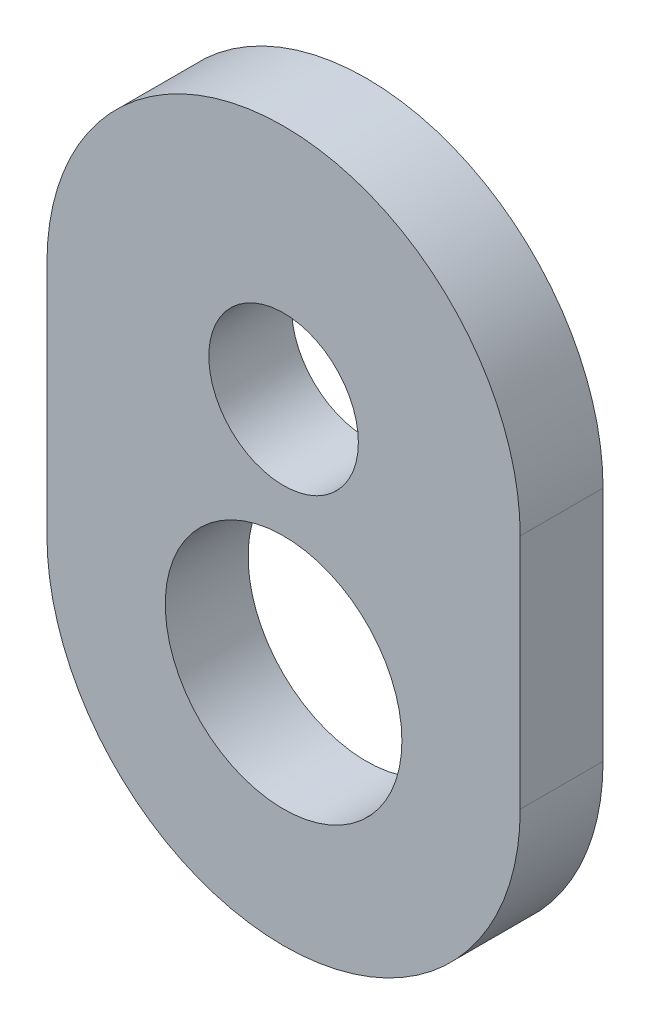
ISO-10303-21;
HEADER;
FILE_DESCRIPTION(('STEP AP214'),'2;1');
FILE_NAME('part.step','',(''),(''),'','','');
FILE_SCHEMA(('AUTOMOTIVE_DESIGN { 1 0 10303 214 1 1 1 1 }'));
ENDSEC;
DATA;
#1=APPLICATION_CONTEXT('core data for automotive mechanical design processes');
#2=APPLICATION_PROTOCOL_DEFINITION('international standard','automotive_design',2000,#1);
#3=PRODUCT_CONTEXT('',#1,'mechanical');
#4=PRODUCT('Part','Part','',(#3));
#5=PRODUCT_RELATED_PRODUCT_CATEGORY('part','',(#4));
#6=PRODUCT_DEFINITION_FORMATION('','',#4);
#7=PRODUCT_DEFINITION_CONTEXT('part definition',#1,'design');
#8=PRODUCT_DEFINITION('design','',#6,#7);
#9=PRODUCT_DEFINITION_SHAPE('','',#8);
#10=(LENGTH_UNIT() NAMED_UNIT(*) SI_UNIT(.MILLI.,.METRE.));
#11=(NAMED_UNIT(*) PLANE_ANGLE_UNIT() SI_UNIT($,.RADIAN.));
#12=(NAMED_UNIT(*) SI_UNIT($,.STERADIAN.) SOLID_ANGLE_UNIT());
#13=UNCERTAINTY_MEASURE_WITH_UNIT(LENGTH_MEASURE(1.E-05),#10,'distance_accuracy_value','');
#14=(GEOMETRIC_REPRESENTATION_CONTEXT(3) GLOBAL_UNCERTAINTY_ASSIGNED_CONTEXT((#13)) GLOBAL_UNIT_ASSIGNED_CONTEXT((#10,
#11,#12)) REPRESENTATION_CONTEXT('',''));
#15=CARTESIAN_POINT('',(0.,0.,0.));
#16=DIRECTION('',(0.,0.,1.));
#17=DIRECTION('',(1.,0.,0.));
#18=AXIS2_PLACEMENT_3D('',#15,#16,#17);
#19=CARTESIAN_POINT('',(25.4,0.,8.89));
#20=DIRECTION('',(0.,0.,-1.));
#21=DIRECTION('',(-1.,0.,0.));
#22=AXIS2_PLACEMENT_3D('',#19,#20,#21);
#23=CYLINDRICAL_SURFACE('',#22,25.4);
#24=CARTESIAN_POINT('',(25.4,0.,0.));
#25=DIRECTION('',(0.,0.,1.));
#26=DIRECTION('',(-1.,0.,0.));
#27=AXIS2_PLACEMENT_3D('',#24,#25,#26);
#28=CIRCLE('',#27,25.4);
#29=CARTESIAN_POINT('',(0.,0.,0.));
#30=VERTEX_POINT('',#29);
#31=CARTESIAN_POINT('',(50.8,0.,0.));
#32=VERTEX_POINT('',#31);
#33=EDGE_CURVE('E110',#30,#32,#28,.T.);
#34=ORIENTED_EDGE('',*,*,#33,.T.);
#35=DIRECTION('',(0.,0.,-1.));
#36=VECTOR('',#35,1.);
#37=CARTESIAN_POINT('',(50.8,0.,8.89));
#38=LINE('',#37,#36);
#39=CARTESIAN_POINT('',(50.8,0.,8.89));
#40=VERTEX_POINT('',#39);
#41=EDGE_CURVE('E11',#40,#32,#38,.T.);
#42=ORIENTED_EDGE('',*,*,#41,.F.);
#43=CARTESIAN_POINT('',(25.4,0.,8.89));
#44=DIRECTION('',(0.,0.,1.));
#45=DIRECTION('',(-1.,0.,0.));
#46=AXIS2_PLACEMENT_3D('',#43,#44,#45);
#47=CIRCLE('',#46,25.4);
#48=CARTESIAN_POINT('',(0.,0.,8.89));
#49=VERTEX_POINT('',#48);
#50=EDGE_CURVE('E98',#49,#40,#47,.T.);
#51=ORIENTED_EDGE('',*,*,#50,.F.);
#52=DIRECTION('',(0.,0.,-1.));
#53=VECTOR('',#52,1.);
#54=CARTESIAN_POINT('',(0.,0.,8.89));
#55=LINE('',#54,#53);
#56=EDGE_CURVE('E106',#49,#30,#55,.T.);
#57=ORIENTED_EDGE('',*,*,#56,.T.);
#58=EDGE_LOOP('',(#34,#42,#51,#57));
#59=FACE_BOUND('',#58,.T.);
#60=ADVANCED_FACE('F47',(#59),#23,.T.);
#61=CARTESIAN_POINT('',(50.8,25.4,8.89));
#62=DIRECTION('',(-1.,0.,0.));
#63=DIRECTION('',(0.,0.,1.));
#64=AXIS2_PLACEMENT_3D('',#61,#62,#63);
#65=PLANE('',#64);
#66=DIRECTION('',(0.,1.,0.));
#67=VECTOR('',#66,1.);
#68=CARTESIAN_POINT('',(50.8,25.4,0.));
#69=LINE('',#68,#67);
#70=CARTESIAN_POINT('',(50.8,25.4,0.));
#71=VERTEX_POINT('',#70);
#72=EDGE_CURVE('E102',#32,#71,#69,.T.);
#73=ORIENTED_EDGE('',*,*,#72,.T.);
#74=DIRECTION('',(0.,0.,-1.));
#75=VECTOR('',#74,1.);
#76=CARTESIAN_POINT('',(50.8,25.4,8.89));
#77=LINE('',#76,#75);
#78=CARTESIAN_POINT('',(50.8,25.4,8.89));
#79=VERTEX_POINT('',#78);
#80=EDGE_CURVE('E55',#79,#71,#77,.T.);
#81=ORIENTED_EDGE('',*,*,#80,.F.);
#82=DIRECTION('',(0.,1.,0.));
#83=VECTOR('',#82,1.);
#84=CARTESIAN_POINT('',(50.8,25.4,8.89));
#85=LINE('',#84,#83);
#86=EDGE_CURVE('E93',#40,#79,#85,.T.);
#87=ORIENTED_EDGE('',*,*,#86,.F.);
#88=ORIENTED_EDGE('',*,*,#41,.T.);
#89=EDGE_LOOP('',(#73,#81,#87,#88));
#90=FACE_BOUND('',#89,.T.);
#91=ADVANCED_FACE('F101',(#90),#65,.F.);
#92=CARTESIAN_POINT('',(25.4,25.4,8.89));
#93=DIRECTION('',(0.,0.,-1.));
#94=DIRECTION('',(-1.,0.,0.));
#95=AXIS2_PLACEMENT_3D('',#92,#93,#94);
#96=CYLINDRICAL_SURFACE('',#95,25.4);
#97=CARTESIAN_POINT('',(25.4,25.4,0.));
#98=DIRECTION('',(0.,0.,1.));
#99=DIRECTION('',(-1.,0.,0.));
#100=AXIS2_PLACEMENT_3D('',#97,#98,#99);
#101=CIRCLE('',#100,25.4);
#102=CARTESIAN_POINT('',(0.,25.4,0.));
#103=VERTEX_POINT('',#102);
#104=EDGE_CURVE('E80',#71,#103,#101,.T.);
#105=ORIENTED_EDGE('',*,*,#104,.T.);
#106=DIRECTION('',(0.,0.,-1.));
#107=VECTOR('',#106,1.);
#108=CARTESIAN_POINT('',(0.,25.4,8.89));
#109=LINE('',#108,#107);
#110=CARTESIAN_POINT('',(0.,25.4,8.89));
#111=VERTEX_POINT('',#110);
#112=EDGE_CURVE('E103',#111,#103,#109,.T.);
#113=ORIENTED_EDGE('',*,*,#112,.F.);
#114=CARTESIAN_POINT('',(25.4,25.4,8.89));
#115=DIRECTION('',(0.,0.,1.));
#116=DIRECTION('',(-1.,0.,0.));
#117=AXIS2_PLACEMENT_3D('',#114,#115,#116);
#118=CIRCLE('',#117,25.4);
#119=EDGE_CURVE('E96',#79,#111,#118,.T.);
#120=ORIENTED_EDGE('',*,*,#119,.F.);
#121=ORIENTED_EDGE('',*,*,#80,.T.);
#122=EDGE_LOOP('',(#105,#113,#120,#121));
#123=FACE_BOUND('',#122,.T.);
#124=ADVANCED_FACE('F104',(#123),#96,.T.);
#125=CARTESIAN_POINT('',(0.,0.,8.89));
#126=DIRECTION('',(1.,0.,0.));
#127=DIRECTION('',(0.,1.,0.));
#128=AXIS2_PLACEMENT_3D('',#125,#126,#127);
#129=PLANE('',#128);
#130=DIRECTION('',(0.,-1.,0.));
#131=VECTOR('',#130,1.);
#132=CARTESIAN_POINT('',(0.,0.,0.));
#133=LINE('',#132,#131);
#134=EDGE_CURVE('E86',#103,#30,#133,.T.);
#135=ORIENTED_EDGE('',*,*,#134,.T.);
#136=ORIENTED_EDGE('',*,*,#56,.F.);
#137=DIRECTION('',(0.,-1.,0.));
#138=VECTOR('',#137,1.);
#139=CARTESIAN_POINT('',(0.,0.,8.89));
#140=LINE('',#139,#138);
#141=EDGE_CURVE('E63',#111,#49,#140,.T.);
#142=ORIENTED_EDGE('',*,*,#141,.F.);
#143=ORIENTED_EDGE('',*,*,#112,.T.);
#144=EDGE_LOOP('',(#135,#136,#142,#143));
#145=FACE_BOUND('',#144,.T.);
#146=ADVANCED_FACE('F118',(#145),#129,.F.);
#147=CARTESIAN_POINT('',(25.4,0.,8.89));
#148=DIRECTION('',(0.,0.,-1.));
#149=DIRECTION('',(-1.,0.,0.));
#150=AXIS2_PLACEMENT_3D('',#147,#148,#149);
#151=PLANE('',#150);
#152=CARTESIAN_POINT('',(25.4,0.,8.89));
#153=DIRECTION('',(0.,0.,1.));
#154=DIRECTION('',(1.,0.,0.));
#155=AXIS2_PLACEMENT_3D('',#152,#153,#154);
#156=CIRCLE('',#155,12.7);
#157=CARTESIAN_POINT('',(38.1,0.,8.89));
#158=VERTEX_POINT('',#157);
#159=EDGE_CURVE('E130',#158,#158,#156,.T.);
#160=ORIENTED_EDGE('',*,*,#159,.F.);
#161=EDGE_LOOP('',(#160));
#162=FACE_BOUND('',#161,.T.);
#163=CARTESIAN_POINT('',(25.4,25.4,8.89));
#164=DIRECTION('',(0.,0.,1.));
#165=DIRECTION('',(1.,0.,0.));
#166=AXIS2_PLACEMENT_3D('',#163,#164,#165);
#167=CIRCLE('',#166,8.0264);
#168=CARTESIAN_POINT('',(33.4264,25.4,8.89));
#169=VERTEX_POINT('',#168);
#170=EDGE_CURVE('E127',#169,#169,#167,.T.);
#171=ORIENTED_EDGE('',*,*,#170,.F.);
#172=EDGE_LOOP('',(#171));
#173=FACE_BOUND('',#172,.T.);
#174=ORIENTED_EDGE('',*,*,#50,.T.);
#175=ORIENTED_EDGE('',*,*,#86,.T.);
#176=ORIENTED_EDGE('',*,*,#119,.T.);
#177=ORIENTED_EDGE('',*,*,#141,.T.);
#178=EDGE_LOOP('',(#174,#175,#176,#177));
#179=FACE_BOUND('',#178,.T.);
#180=ADVANCED_FACE('F94',(#162,#173,#179),#151,.F.);
#181=CARTESIAN_POINT('',(25.4,0.,0.));
#182=DIRECTION('',(0.,0.,-1.));
#183=DIRECTION('',(-1.,0.,0.));
#184=AXIS2_PLACEMENT_3D('',#181,#182,#183);
#185=PLANE('',#184);
#186=CARTESIAN_POINT('',(25.4,0.,0.));
#187=DIRECTION('',(0.,0.,1.));
#188=DIRECTION('',(1.,0.,0.));
#189=AXIS2_PLACEMENT_3D('',#186,#187,#188);
#190=CIRCLE('',#189,12.7);
#191=CARTESIAN_POINT('',(38.1,0.,0.));
#192=VERTEX_POINT('',#191);
#193=EDGE_CURVE('E113',#192,#192,#190,.T.);
#194=ORIENTED_EDGE('',*,*,#193,.T.);
#195=EDGE_LOOP('',(#194));
#196=FACE_BOUND('',#195,.T.);
#197=CARTESIAN_POINT('',(25.4,25.4,0.));
#198=DIRECTION('',(0.,0.,1.));
#199=DIRECTION('',(1.,0.,0.));
#200=AXIS2_PLACEMENT_3D('',#197,#198,#199);
#201=CIRCLE('',#200,8.0264);
#202=CARTESIAN_POINT('',(33.4264,25.4,0.));
#203=VERTEX_POINT('',#202);
#204=EDGE_CURVE('E124',#203,#203,#201,.T.);
#205=ORIENTED_EDGE('',*,*,#204,.T.);
#206=EDGE_LOOP('',(#205));
#207=FACE_BOUND('',#206,.T.);
#208=ORIENTED_EDGE('',*,*,#33,.F.);
#209=ORIENTED_EDGE('',*,*,#134,.F.);
#210=ORIENTED_EDGE('',*,*,#104,.F.);
#211=ORIENTED_EDGE('',*,*,#72,.F.);
#212=EDGE_LOOP('',(#208,#209,#210,#211));
#213=FACE_BOUND('',#212,.T.);
#214=ADVANCED_FACE('F121',(#196,#207,#213),#185,.T.);
#215=CARTESIAN_POINT('',(25.4,25.4,0.));
#216=DIRECTION('',(0.,0.,1.));
#217=DIRECTION('',(1.,0.,0.));
#218=AXIS2_PLACEMENT_3D('',#215,#216,#217);
#219=CYLINDRICAL_SURFACE('',#218,8.0264);
#220=ORIENTED_EDGE('',*,*,#204,.F.);
#221=EDGE_LOOP('',(#220));
#222=FACE_BOUND('',#221,.T.);
#223=ORIENTED_EDGE('',*,*,#170,.T.);
#224=EDGE_LOOP('',(#223));
#225=FACE_BOUND('',#224,.T.);
#226=ADVANCED_FACE('F141',(#222,#225),#219,.F.);
#227=CARTESIAN_POINT('',(25.4,0.,0.));
#228=DIRECTION('',(0.,0.,1.));
#229=DIRECTION('',(1.,0.,0.));
#230=AXIS2_PLACEMENT_3D('',#227,#228,#229);
#231=CYLINDRICAL_SURFACE('',#230,12.7);
#232=ORIENTED_EDGE('',*,*,#193,.F.);
#233=EDGE_LOOP('',(#232));
#234=FACE_BOUND('',#233,.T.);
#235=ORIENTED_EDGE('',*,*,#159,.T.);
#236=EDGE_LOOP('',(#235));
#237=FACE_BOUND('',#236,.T.);
#238=ADVANCED_FACE('F138',(#234,#237),#231,.F.);
#239=CLOSED_SHELL('',(#60,#91,#124,#146,#180,#214,#226,#238));
#240=MANIFOLD_SOLID_BREP('B2',#239);
#241=ADVANCED_BREP_SHAPE_REPRESENTATION('',(#18,#240),#14);
#242=SHAPE_DEFINITION_REPRESENTATION(#9,#241);
ENDSEC;
END-ISO-10303-21;
